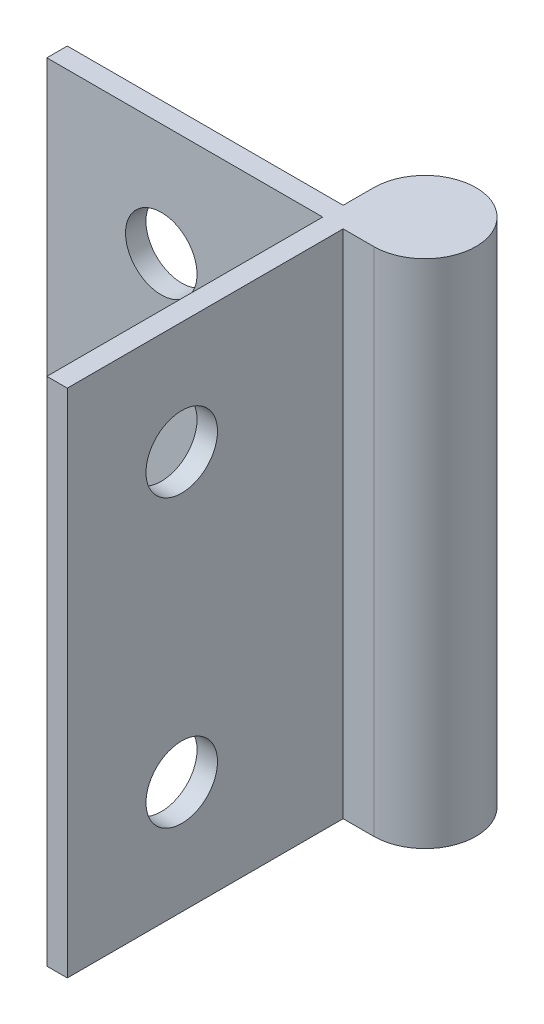
ISO-10303-21;
HEADER;
FILE_DESCRIPTION(('STEP AP214'),'2;1');
FILE_NAME('part.step','',(''),(''),'','','');
FILE_SCHEMA(('AUTOMOTIVE_DESIGN { 1 0 10303 214 1 1 1 1 }'));
ENDSEC;
DATA;
#1=APPLICATION_CONTEXT('core data for automotive mechanical design processes');
#2=APPLICATION_PROTOCOL_DEFINITION('international standard','automotive_design',2000,#1);
#3=PRODUCT_CONTEXT('',#1,'mechanical');
#4=PRODUCT('Part','Part','',(#3));
#5=PRODUCT_RELATED_PRODUCT_CATEGORY('part','',(#4));
#6=PRODUCT_DEFINITION_FORMATION('','',#4);
#7=PRODUCT_DEFINITION_CONTEXT('part definition',#1,'design');
#8=PRODUCT_DEFINITION('design','',#6,#7);
#9=PRODUCT_DEFINITION_SHAPE('','',#8);
#10=(LENGTH_UNIT() NAMED_UNIT(*) SI_UNIT(.MILLI.,.METRE.));
#11=(NAMED_UNIT(*) PLANE_ANGLE_UNIT() SI_UNIT($,.RADIAN.));
#12=(NAMED_UNIT(*) SI_UNIT($,.STERADIAN.) SOLID_ANGLE_UNIT());
#13=UNCERTAINTY_MEASURE_WITH_UNIT(LENGTH_MEASURE(1.E-05),#10,'distance_accuracy_value','');
#14=(GEOMETRIC_REPRESENTATION_CONTEXT(3) GLOBAL_UNCERTAINTY_ASSIGNED_CONTEXT((#13)) GLOBAL_UNIT_ASSIGNED_CONTEXT((#10,
#11,#12)) REPRESENTATION_CONTEXT('',''));
#15=CARTESIAN_POINT('',(0.,0.,0.));
#16=DIRECTION('',(0.,0.,1.));
#17=DIRECTION('',(1.,0.,0.));
#18=AXIS2_PLACEMENT_3D('',#15,#16,#17);
#19=CARTESIAN_POINT('',(-1.5,12.5,0.));
#20=DIRECTION('',(1.,0.,0.));
#21=DIRECTION('',(0.,0.,-1.));
#22=AXIS2_PLACEMENT_3D('',#19,#20,#21);
#23=PLANE('',#22);
#24=CARTESIAN_POINT('',(-1.5,-7.,10.4));
#25=DIRECTION('',(1.,0.,0.));
#26=DIRECTION('',(0.,0.,-1.));
#27=AXIS2_PLACEMENT_3D('',#24,#25,#26);
#28=CIRCLE('',#27,1.75);
#29=CARTESIAN_POINT('',(-1.5,-7.,8.65));
#30=VERTEX_POINT('',#29);
#31=EDGE_CURVE('E256',#30,#30,#28,.T.);
#32=ORIENTED_EDGE('',*,*,#31,.F.);
#33=EDGE_LOOP('',(#32));
#34=FACE_BOUND('',#33,.T.);
#35=CARTESIAN_POINT('',(-1.5,7.,10.4));
#36=DIRECTION('',(1.,0.,0.));
#37=DIRECTION('',(0.,0.,-1.));
#38=AXIS2_PLACEMENT_3D('',#35,#36,#37);
#39=CIRCLE('',#38,1.75);
#40=CARTESIAN_POINT('',(-1.5,7.,8.65));
#41=VERTEX_POINT('',#40);
#42=EDGE_CURVE('E246',#41,#41,#39,.T.);
#43=ORIENTED_EDGE('',*,*,#42,.F.);
#44=EDGE_LOOP('',(#43));
#45=FACE_BOUND('',#44,.T.);
#46=DIRECTION('',(0.,0.,1.));
#47=VECTOR('',#46,1.);
#48=CARTESIAN_POINT('',(-1.5,-12.5,0.));
#49=LINE('',#48,#47);
#50=CARTESIAN_POINT('',(-1.5,-12.5,2.5));
#51=VERTEX_POINT('',#50);
#52=CARTESIAN_POINT('',(-1.5,-12.5,16.));
#53=VERTEX_POINT('',#52);
#54=EDGE_CURVE('E210',#51,#53,#49,.T.);
#55=ORIENTED_EDGE('',*,*,#54,.F.);
#56=DIRECTION('',(0.,-1.,0.));
#57=VECTOR('',#56,1.);
#58=CARTESIAN_POINT('',(-1.5,12.5,2.5));
#59=LINE('',#58,#57);
#60=CARTESIAN_POINT('',(-1.5,12.5,2.5));
#61=VERTEX_POINT('',#60);
#62=EDGE_CURVE('E228',#61,#51,#59,.T.);
#63=ORIENTED_EDGE('',*,*,#62,.F.);
#64=DIRECTION('',(0.,0.,1.));
#65=VECTOR('',#64,1.);
#66=CARTESIAN_POINT('',(-1.5,12.5,0.));
#67=LINE('',#66,#65);
#68=CARTESIAN_POINT('',(-1.5,12.5,16.));
#69=VERTEX_POINT('',#68);
#70=EDGE_CURVE('E191',#61,#69,#67,.T.);
#71=ORIENTED_EDGE('',*,*,#70,.T.);
#72=DIRECTION('',(0.,-1.,0.));
#73=VECTOR('',#72,1.);
#74=CARTESIAN_POINT('',(-1.5,12.5,16.));
#75=LINE('',#74,#73);
#76=EDGE_CURVE('E230',#69,#53,#75,.T.);
#77=ORIENTED_EDGE('',*,*,#76,.T.);
#78=EDGE_LOOP('',(#55,#63,#71,#77));
#79=FACE_BOUND('',#78,.T.);
#80=ADVANCED_FACE('F89',(#34,#45,#79),#23,.T.);
#81=CARTESIAN_POINT('',(0.,12.5,16.));
#82=DIRECTION('',(0.,0.,1.));
#83=DIRECTION('',(1.,0.,0.));
#84=AXIS2_PLACEMENT_3D('',#81,#82,#83);
#85=PLANE('',#84);
#86=DIRECTION('',(-1.,0.,0.));
#87=VECTOR('',#86,1.);
#88=CARTESIAN_POINT('',(0.,-12.5,16.));
#89=LINE('',#88,#87);
#90=CARTESIAN_POINT('',(-2.5,-12.5,16.));
#91=VERTEX_POINT('',#90);
#92=EDGE_CURVE('E207',#53,#91,#89,.T.);
#93=ORIENTED_EDGE('',*,*,#92,.F.);
#94=ORIENTED_EDGE('',*,*,#76,.F.);
#95=DIRECTION('',(-1.,0.,0.));
#96=VECTOR('',#95,1.);
#97=CARTESIAN_POINT('',(0.,12.5,16.));
#98=LINE('',#97,#96);
#99=CARTESIAN_POINT('',(-2.5,12.5,16.));
#100=VERTEX_POINT('',#99);
#101=EDGE_CURVE('E175',#69,#100,#98,.T.);
#102=ORIENTED_EDGE('',*,*,#101,.T.);
#103=DIRECTION('',(0.,-1.,0.));
#104=VECTOR('',#103,1.);
#105=CARTESIAN_POINT('',(-2.5,12.5,16.));
#106=LINE('',#105,#104);
#107=EDGE_CURVE('E167',#100,#91,#106,.T.);
#108=ORIENTED_EDGE('',*,*,#107,.T.);
#109=EDGE_LOOP('',(#93,#94,#102,#108));
#110=FACE_BOUND('',#109,.T.);
#111=ADVANCED_FACE('F273',(#110),#85,.T.);
#112=CARTESIAN_POINT('',(-2.5,12.5,0.));
#113=DIRECTION('',(1.,0.,0.));
#114=DIRECTION('',(0.,0.,-1.));
#115=AXIS2_PLACEMENT_3D('',#112,#113,#114);
#116=PLANE('',#115);
#117=CARTESIAN_POINT('',(-2.5,-7.,10.4));
#118=DIRECTION('',(1.,0.,0.));
#119=DIRECTION('',(0.,0.,-1.));
#120=AXIS2_PLACEMENT_3D('',#117,#118,#119);
#121=CIRCLE('',#120,1.75);
#122=CARTESIAN_POINT('',(-2.5,-7.,8.65));
#123=VERTEX_POINT('',#122);
#124=EDGE_CURVE('E252',#123,#123,#121,.T.);
#125=ORIENTED_EDGE('',*,*,#124,.T.);
#126=EDGE_LOOP('',(#125));
#127=FACE_BOUND('',#126,.T.);
#128=CARTESIAN_POINT('',(-2.5,7.,10.4));
#129=DIRECTION('',(1.,0.,0.));
#130=DIRECTION('',(0.,0.,-1.));
#131=AXIS2_PLACEMENT_3D('',#128,#129,#130);
#132=CIRCLE('',#131,1.75);
#133=CARTESIAN_POINT('',(-2.5,7.,8.65));
#134=VERTEX_POINT('',#133);
#135=EDGE_CURVE('E261',#134,#134,#132,.T.);
#136=ORIENTED_EDGE('',*,*,#135,.T.);
#137=EDGE_LOOP('',(#136));
#138=FACE_BOUND('',#137,.T.);
#139=DIRECTION('',(0.,0.,1.));
#140=VECTOR('',#139,1.);
#141=CARTESIAN_POINT('',(-2.5,-12.5,0.));
#142=LINE('',#141,#140);
#143=CARTESIAN_POINT('',(-2.5,-12.5,2.5));
#144=VERTEX_POINT('',#143);
#145=EDGE_CURVE('E204',#144,#91,#142,.T.);
#146=ORIENTED_EDGE('',*,*,#145,.T.);
#147=ORIENTED_EDGE('',*,*,#107,.F.);
#148=DIRECTION('',(0.,0.,1.));
#149=VECTOR('',#148,1.);
#150=CARTESIAN_POINT('',(-2.5,12.5,0.));
#151=LINE('',#150,#149);
#152=CARTESIAN_POINT('',(-2.5,12.5,2.5));
#153=VERTEX_POINT('',#152);
#154=EDGE_CURVE('E170',#153,#100,#151,.T.);
#155=ORIENTED_EDGE('',*,*,#154,.F.);
#156=DIRECTION('',(0.,-1.,0.));
#157=VECTOR('',#156,1.);
#158=CARTESIAN_POINT('',(-2.5,12.5,2.5));
#159=LINE('',#158,#157);
#160=EDGE_CURVE('E97',#153,#144,#159,.T.);
#161=ORIENTED_EDGE('',*,*,#160,.T.);
#162=EDGE_LOOP('',(#146,#147,#155,#161));
#163=FACE_BOUND('',#162,.T.);
#164=ADVANCED_FACE('F171',(#127,#138,#163),#116,.F.);
#165=CARTESIAN_POINT('',(0.,12.5,0.));
#166=DIRECTION('',(0.,-1.,0.));
#167=DIRECTION('',(0.,0.,-1.));
#168=AXIS2_PLACEMENT_3D('',#165,#166,#167);
#169=CYLINDRICAL_SURFACE('',#168,2.5);
#170=CARTESIAN_POINT('',(0.,-12.5,0.));
#171=DIRECTION('',(0.,1.,0.));
#172=DIRECTION('',(0.,0.,1.));
#173=AXIS2_PLACEMENT_3D('',#170,#171,#172);
#174=CIRCLE('',#173,2.5);
#175=CARTESIAN_POINT('',(0.,-12.5,2.5));
#176=VERTEX_POINT('',#175);
#177=CARTESIAN_POINT('',(-2.5,-12.5,0.));
#178=VERTEX_POINT('',#177);
#179=EDGE_CURVE('E216',#176,#178,#174,.T.);
#180=ORIENTED_EDGE('',*,*,#179,.T.);
#181=DIRECTION('',(0.,-1.,0.));
#182=VECTOR('',#181,1.);
#183=CARTESIAN_POINT('',(-2.5,12.5,0.));
#184=LINE('',#183,#182);
#185=CARTESIAN_POINT('',(-2.5,12.5,0.));
#186=VERTEX_POINT('',#185);
#187=EDGE_CURVE('E224',#186,#178,#184,.T.);
#188=ORIENTED_EDGE('',*,*,#187,.F.);
#189=CARTESIAN_POINT('',(0.,12.5,0.));
#190=DIRECTION('',(0.,1.,0.));
#191=DIRECTION('',(0.,0.,1.));
#192=AXIS2_PLACEMENT_3D('',#189,#190,#191);
#193=CIRCLE('',#192,2.5);
#194=CARTESIAN_POINT('',(0.,12.5,2.5));
#195=VERTEX_POINT('',#194);
#196=EDGE_CURVE('E197',#195,#186,#193,.T.);
#197=ORIENTED_EDGE('',*,*,#196,.F.);
#198=DIRECTION('',(0.,-1.,0.));
#199=VECTOR('',#198,1.);
#200=CARTESIAN_POINT('',(0.,12.5,2.5));
#201=LINE('',#200,#199);
#202=EDGE_CURVE('E226',#195,#176,#201,.T.);
#203=ORIENTED_EDGE('',*,*,#202,.T.);
#204=EDGE_LOOP('',(#180,#188,#197,#203));
#205=FACE_BOUND('',#204,.T.);
#206=ADVANCED_FACE('F294',(#205),#169,.T.);
#207=CARTESIAN_POINT('',(0.,12.5,2.5));
#208=DIRECTION('',(0.,0.,1.));
#209=DIRECTION('',(1.,0.,0.));
#210=AXIS2_PLACEMENT_3D('',#207,#208,#209);
#211=PLANE('',#210);
#212=DIRECTION('',(-1.,0.,0.));
#213=VECTOR('',#212,1.);
#214=CARTESIAN_POINT('',(0.,-12.5,2.5));
#215=LINE('',#214,#213);
#216=EDGE_CURVE('E213',#176,#51,#215,.T.);
#217=ORIENTED_EDGE('',*,*,#216,.F.);
#218=ORIENTED_EDGE('',*,*,#202,.F.);
#219=DIRECTION('',(-1.,0.,0.));
#220=VECTOR('',#219,1.);
#221=CARTESIAN_POINT('',(0.,12.5,2.5));
#222=LINE('',#221,#220);
#223=EDGE_CURVE('E194',#195,#61,#222,.T.);
#224=ORIENTED_EDGE('',*,*,#223,.T.);
#225=ORIENTED_EDGE('',*,*,#62,.T.);
#226=EDGE_LOOP('',(#217,#218,#224,#225));
#227=FACE_BOUND('',#226,.T.);
#228=ADVANCED_FACE('F284',(#227),#211,.T.);
#229=CARTESIAN_POINT('',(0.,-12.5,0.));
#230=DIRECTION('',(0.,1.,0.));
#231=DIRECTION('',(0.,0.,1.));
#232=AXIS2_PLACEMENT_3D('',#229,#230,#231);
#233=PLANE('',#232);
#234=DIRECTION('',(0.,0.,1.));
#235=VECTOR('',#234,1.);
#236=CARTESIAN_POINT('',(-2.5,-12.5,0.));
#237=LINE('',#236,#235);
#238=CARTESIAN_POINT('',(-2.5,-12.5,1.5));
#239=VERTEX_POINT('',#238);
#240=EDGE_CURVE('E233',#178,#239,#237,.T.);
#241=ORIENTED_EDGE('',*,*,#240,.F.);
#242=ORIENTED_EDGE('',*,*,#179,.F.);
#243=ORIENTED_EDGE('',*,*,#216,.T.);
#244=ORIENTED_EDGE('',*,*,#54,.T.);
#245=ORIENTED_EDGE('',*,*,#92,.T.);
#246=ORIENTED_EDGE('',*,*,#145,.F.);
#247=DIRECTION('',(-1.,0.,0.));
#248=VECTOR('',#247,1.);
#249=CARTESIAN_POINT('',(0.,-12.5,2.5));
#250=LINE('',#249,#248);
#251=CARTESIAN_POINT('',(-16.,-12.5,2.5));
#252=VERTEX_POINT('',#251);
#253=EDGE_CURVE('E163',#144,#252,#250,.T.);
#254=ORIENTED_EDGE('',*,*,#253,.T.);
#255=DIRECTION('',(0.,0.,-1.));
#256=VECTOR('',#255,1.);
#257=CARTESIAN_POINT('',(-16.,-12.5,0.));
#258=LINE('',#257,#256);
#259=CARTESIAN_POINT('',(-16.,-12.5,1.5));
#260=VERTEX_POINT('',#259);
#261=EDGE_CURVE('E181',#252,#260,#258,.T.);
#262=ORIENTED_EDGE('',*,*,#261,.T.);
#263=DIRECTION('',(-1.,0.,0.));
#264=VECTOR('',#263,1.);
#265=CARTESIAN_POINT('',(0.,-12.5,1.5));
#266=LINE('',#265,#264);
#267=EDGE_CURVE('E184',#239,#260,#266,.T.);
#268=ORIENTED_EDGE('',*,*,#267,.F.);
#269=EDGE_LOOP('',(#241,#242,#243,#244,#245,#246,#254,#262,#268));
#270=FACE_BOUND('',#269,.T.);
#271=ADVANCED_FACE('F282',(#270),#233,.F.);
#272=CARTESIAN_POINT('',(0.,12.5,0.));
#273=DIRECTION('',(0.,1.,0.));
#274=DIRECTION('',(0.,0.,1.));
#275=AXIS2_PLACEMENT_3D('',#272,#273,#274);
#276=PLANE('',#275);
#277=ORIENTED_EDGE('',*,*,#196,.T.);
#278=DIRECTION('',(0.,0.,1.));
#279=VECTOR('',#278,1.);
#280=CARTESIAN_POINT('',(-2.5,12.5,0.));
#281=LINE('',#280,#279);
#282=CARTESIAN_POINT('',(-2.5,12.5,1.5));
#283=VERTEX_POINT('',#282);
#284=EDGE_CURVE('E205',#186,#283,#281,.T.);
#285=ORIENTED_EDGE('',*,*,#284,.T.);
#286=DIRECTION('',(-1.,0.,0.));
#287=VECTOR('',#286,1.);
#288=CARTESIAN_POINT('',(0.,12.5,1.5));
#289=LINE('',#288,#287);
#290=CARTESIAN_POINT('',(-16.,12.5,1.5));
#291=VERTEX_POINT('',#290);
#292=EDGE_CURVE('E199',#283,#291,#289,.T.);
#293=ORIENTED_EDGE('',*,*,#292,.T.);
#294=DIRECTION('',(0.,0.,-1.));
#295=VECTOR('',#294,1.);
#296=CARTESIAN_POINT('',(-16.,12.5,0.));
#297=LINE('',#296,#295);
#298=CARTESIAN_POINT('',(-16.,12.5,2.5));
#299=VERTEX_POINT('',#298);
#300=EDGE_CURVE('E180',#299,#291,#297,.T.);
#301=ORIENTED_EDGE('',*,*,#300,.F.);
#302=DIRECTION('',(-1.,0.,0.));
#303=VECTOR('',#302,1.);
#304=CARTESIAN_POINT('',(0.,12.5,2.5));
#305=LINE('',#304,#303);
#306=EDGE_CURVE('E160',#153,#299,#305,.T.);
#307=ORIENTED_EDGE('',*,*,#306,.F.);
#308=ORIENTED_EDGE('',*,*,#154,.T.);
#309=ORIENTED_EDGE('',*,*,#101,.F.);
#310=ORIENTED_EDGE('',*,*,#70,.F.);
#311=ORIENTED_EDGE('',*,*,#223,.F.);
#312=EDGE_LOOP('',(#277,#285,#293,#301,#307,#308,#309,#310,#311));
#313=FACE_BOUND('',#312,.T.);
#314=ADVANCED_FACE('F178',(#313),#276,.T.);
#315=CARTESIAN_POINT('',(0.,12.5,1.5));
#316=DIRECTION('',(0.,0.,1.));
#317=DIRECTION('',(1.,0.,0.));
#318=AXIS2_PLACEMENT_3D('',#315,#316,#317);
#319=PLANE('',#318);
#320=CARTESIAN_POINT('',(-10.4,-7.,1.5));
#321=DIRECTION('',(0.,0.,-1.));
#322=DIRECTION('',(-1.,0.,0.));
#323=AXIS2_PLACEMENT_3D('',#320,#321,#322);
#324=CIRCLE('',#323,1.75);
#325=CARTESIAN_POINT('',(-12.15,-7.,1.5));
#326=VERTEX_POINT('',#325);
#327=EDGE_CURVE('E238',#326,#326,#324,.T.);
#328=ORIENTED_EDGE('',*,*,#327,.F.);
#329=EDGE_LOOP('',(#328));
#330=FACE_BOUND('',#329,.T.);
#331=CARTESIAN_POINT('',(-10.4,7.,1.5));
#332=DIRECTION('',(0.,0.,-1.));
#333=DIRECTION('',(-1.,0.,0.));
#334=AXIS2_PLACEMENT_3D('',#331,#332,#333);
#335=CIRCLE('',#334,1.75);
#336=CARTESIAN_POINT('',(-12.15,7.,1.5));
#337=VERTEX_POINT('',#336);
#338=EDGE_CURVE('E187',#337,#337,#335,.T.);
#339=ORIENTED_EDGE('',*,*,#338,.F.);
#340=EDGE_LOOP('',(#339));
#341=FACE_BOUND('',#340,.T.);
#342=DIRECTION('',(0.,1.,0.));
#343=VECTOR('',#342,1.);
#344=CARTESIAN_POINT('',(-2.5,12.5,1.5));
#345=LINE('',#344,#343);
#346=EDGE_CURVE('E12',#239,#283,#345,.T.);
#347=ORIENTED_EDGE('',*,*,#346,.F.);
#348=ORIENTED_EDGE('',*,*,#267,.T.);
#349=DIRECTION('',(0.,-1.,0.));
#350=VECTOR('',#349,1.);
#351=CARTESIAN_POINT('',(-16.,12.5,1.5));
#352=LINE('',#351,#350);
#353=EDGE_CURVE('E221',#291,#260,#352,.T.);
#354=ORIENTED_EDGE('',*,*,#353,.F.);
#355=ORIENTED_EDGE('',*,*,#292,.F.);
#356=EDGE_LOOP('',(#347,#348,#354,#355));
#357=FACE_BOUND('',#356,.T.);
#358=ADVANCED_FACE('F292',(#330,#341,#357),#319,.F.);
#359=CARTESIAN_POINT('',(-16.,12.5,0.));
#360=DIRECTION('',(-1.,0.,0.));
#361=DIRECTION('',(0.,0.,1.));
#362=AXIS2_PLACEMENT_3D('',#359,#360,#361);
#363=PLANE('',#362);
#364=ORIENTED_EDGE('',*,*,#261,.F.);
#365=DIRECTION('',(0.,-1.,0.));
#366=VECTOR('',#365,1.);
#367=CARTESIAN_POINT('',(-16.,12.5,2.5));
#368=LINE('',#367,#366);
#369=EDGE_CURVE('E202',#299,#252,#368,.T.);
#370=ORIENTED_EDGE('',*,*,#369,.F.);
#371=ORIENTED_EDGE('',*,*,#300,.T.);
#372=ORIENTED_EDGE('',*,*,#353,.T.);
#373=EDGE_LOOP('',(#364,#370,#371,#372));
#374=FACE_BOUND('',#373,.T.);
#375=ADVANCED_FACE('F290',(#374),#363,.T.);
#376=CARTESIAN_POINT('',(0.,12.5,2.5));
#377=DIRECTION('',(0.,0.,1.));
#378=DIRECTION('',(1.,0.,0.));
#379=AXIS2_PLACEMENT_3D('',#376,#377,#378);
#380=PLANE('',#379);
#381=CARTESIAN_POINT('',(-10.4,-7.,2.5));
#382=DIRECTION('',(0.,0.,-1.));
#383=DIRECTION('',(-1.,0.,0.));
#384=AXIS2_PLACEMENT_3D('',#381,#382,#383);
#385=CIRCLE('',#384,1.75);
#386=CARTESIAN_POINT('',(-12.15,-7.,2.5));
#387=VERTEX_POINT('',#386);
#388=EDGE_CURVE('E234',#387,#387,#385,.T.);
#389=ORIENTED_EDGE('',*,*,#388,.T.);
#390=EDGE_LOOP('',(#389));
#391=FACE_BOUND('',#390,.T.);
#392=CARTESIAN_POINT('',(-10.4,7.,2.5));
#393=DIRECTION('',(0.,0.,-1.));
#394=DIRECTION('',(-1.,0.,0.));
#395=AXIS2_PLACEMENT_3D('',#392,#393,#394);
#396=CIRCLE('',#395,1.75);
#397=CARTESIAN_POINT('',(-12.15,7.,2.5));
#398=VERTEX_POINT('',#397);
#399=EDGE_CURVE('E243',#398,#398,#396,.T.);
#400=ORIENTED_EDGE('',*,*,#399,.T.);
#401=EDGE_LOOP('',(#400));
#402=FACE_BOUND('',#401,.T.);
#403=ORIENTED_EDGE('',*,*,#253,.F.);
#404=ORIENTED_EDGE('',*,*,#160,.F.);
#405=ORIENTED_EDGE('',*,*,#306,.T.);
#406=ORIENTED_EDGE('',*,*,#369,.T.);
#407=EDGE_LOOP('',(#403,#404,#405,#406));
#408=FACE_BOUND('',#407,.T.);
#409=ADVANCED_FACE('F158',(#391,#402,#408),#380,.T.);
#410=CARTESIAN_POINT('',(-2.5,12.5,0.));
#411=DIRECTION('',(1.,0.,0.));
#412=DIRECTION('',(0.,0.,-1.));
#413=AXIS2_PLACEMENT_3D('',#410,#411,#412);
#414=PLANE('',#413);
#415=ORIENTED_EDGE('',*,*,#240,.T.);
#416=ORIENTED_EDGE('',*,*,#346,.T.);
#417=ORIENTED_EDGE('',*,*,#284,.F.);
#418=ORIENTED_EDGE('',*,*,#187,.T.);
#419=EDGE_LOOP('',(#415,#416,#417,#418));
#420=FACE_BOUND('',#419,.T.);
#421=ADVANCED_FACE('F91',(#420),#414,.F.);
#422=CARTESIAN_POINT('',(-10.4,7.,2.5));
#423=DIRECTION('',(0.,0.,-1.));
#424=DIRECTION('',(-1.,0.,0.));
#425=AXIS2_PLACEMENT_3D('',#422,#423,#424);
#426=CYLINDRICAL_SURFACE('',#425,1.75);
#427=ORIENTED_EDGE('',*,*,#399,.F.);
#428=EDGE_LOOP('',(#427));
#429=FACE_BOUND('',#428,.T.);
#430=ORIENTED_EDGE('',*,*,#338,.T.);
#431=EDGE_LOOP('',(#430));
#432=FACE_BOUND('',#431,.T.);
#433=ADVANCED_FACE('F296',(#429,#432),#426,.F.);
#434=CARTESIAN_POINT('',(-10.4,-7.,2.5));
#435=DIRECTION('',(0.,0.,-1.));
#436=DIRECTION('',(-1.,0.,0.));
#437=AXIS2_PLACEMENT_3D('',#434,#435,#436);
#438=CYLINDRICAL_SURFACE('',#437,1.75);
#439=ORIENTED_EDGE('',*,*,#388,.F.);
#440=EDGE_LOOP('',(#439));
#441=FACE_BOUND('',#440,.T.);
#442=ORIENTED_EDGE('',*,*,#327,.T.);
#443=EDGE_LOOP('',(#442));
#444=FACE_BOUND('',#443,.T.);
#445=ADVANCED_FACE('F301',(#441,#444),#438,.F.);
#446=CARTESIAN_POINT('',(-2.5,7.,10.4));
#447=DIRECTION('',(1.,0.,0.));
#448=DIRECTION('',(0.,0.,-1.));
#449=AXIS2_PLACEMENT_3D('',#446,#447,#448);
#450=CYLINDRICAL_SURFACE('',#449,1.75);
#451=ORIENTED_EDGE('',*,*,#135,.F.);
#452=EDGE_LOOP('',(#451));
#453=FACE_BOUND('',#452,.T.);
#454=ORIENTED_EDGE('',*,*,#42,.T.);
#455=EDGE_LOOP('',(#454));
#456=FACE_BOUND('',#455,.T.);
#457=ADVANCED_FACE('F269',(#453,#456),#450,.F.);
#458=CARTESIAN_POINT('',(-2.5,-7.,10.4));
#459=DIRECTION('',(1.,0.,0.));
#460=DIRECTION('',(0.,0.,-1.));
#461=AXIS2_PLACEMENT_3D('',#458,#459,#460);
#462=CYLINDRICAL_SURFACE('',#461,1.75);
#463=ORIENTED_EDGE('',*,*,#124,.F.);
#464=EDGE_LOOP('',(#463));
#465=FACE_BOUND('',#464,.T.);
#466=ORIENTED_EDGE('',*,*,#31,.T.);
#467=EDGE_LOOP('',(#466));
#468=FACE_BOUND('',#467,.T.);
#469=ADVANCED_FACE('F334',(#465,#468),#462,.F.);
#470=CLOSED_SHELL('',(#80,#111,#164,#206,#228,#271,#314,#358,#375,#409,#421,#433,#445,#457,#469));
#471=MANIFOLD_SOLID_BREP('B2',#470);
#472=ADVANCED_BREP_SHAPE_REPRESENTATION('',(#18,#471),#14);
#473=SHAPE_DEFINITION_REPRESENTATION(#9,#472);
ENDSEC;
END-ISO-10303-21;
